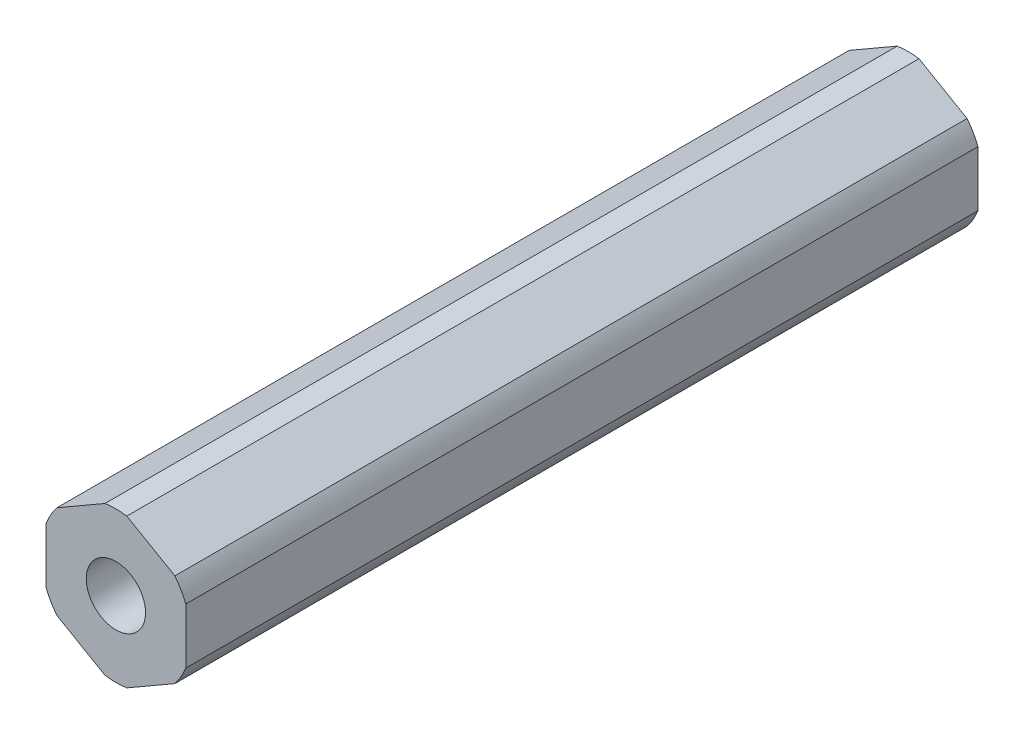
ISO-10303-21;
HEADER;
FILE_DESCRIPTION(('STEP AP214'),'2;1');
FILE_NAME('part.step','',(''),(''),'','','');
FILE_SCHEMA(('AUTOMOTIVE_DESIGN { 1 0 10303 214 1 1 1 1 }'));
ENDSEC;
DATA;
#1=APPLICATION_CONTEXT('core data for automotive mechanical design processes');
#2=APPLICATION_PROTOCOL_DEFINITION('international standard','automotive_design',2000,#1);
#3=PRODUCT_CONTEXT('',#1,'mechanical');
#4=PRODUCT('Part','Part','',(#3));
#5=PRODUCT_RELATED_PRODUCT_CATEGORY('part','',(#4));
#6=PRODUCT_DEFINITION_FORMATION('','',#4);
#7=PRODUCT_DEFINITION_CONTEXT('part definition',#1,'design');
#8=PRODUCT_DEFINITION('design','',#6,#7);
#9=PRODUCT_DEFINITION_SHAPE('','',#8);
#10=(LENGTH_UNIT() NAMED_UNIT(*) SI_UNIT(.MILLI.,.METRE.));
#11=(NAMED_UNIT(*) PLANE_ANGLE_UNIT() SI_UNIT($,.RADIAN.));
#12=(NAMED_UNIT(*) SI_UNIT($,.STERADIAN.) SOLID_ANGLE_UNIT());
#13=UNCERTAINTY_MEASURE_WITH_UNIT(LENGTH_MEASURE(1.E-05),#10,'distance_accuracy_value','');
#14=(GEOMETRIC_REPRESENTATION_CONTEXT(3) GLOBAL_UNCERTAINTY_ASSIGNED_CONTEXT((#13)) GLOBAL_UNIT_ASSIGNED_CONTEXT((#10,
#11,#12)) REPRESENTATION_CONTEXT('',''));
#15=CARTESIAN_POINT('',(0.,0.,0.));
#16=DIRECTION('',(0.,0.,1.));
#17=DIRECTION('',(1.,0.,0.));
#18=AXIS2_PLACEMENT_3D('',#15,#16,#17);
#19=CARTESIAN_POINT('',(4.7625,0.,26.9875));
#20=DIRECTION('',(-1.,0.,0.));
#21=DIRECTION('',(0.,-1.,0.));
#22=AXIS2_PLACEMENT_3D('',#19,#20,#21);
#23=PLANE('',#22);
#24=DIRECTION('',(0.,1.,0.));
#25=VECTOR('',#24,1.);
#26=CARTESIAN_POINT('',(4.7625,0.,-26.9875));
#27=LINE('',#26,#25);
#28=CARTESIAN_POINT('',(4.7625,-1.89171391930704,-26.9875));
#29=VERTEX_POINT('',#28);
#30=CARTESIAN_POINT('',(4.7625,1.89171391930704,-26.9875));
#31=VERTEX_POINT('',#30);
#32=EDGE_CURVE('E156',#29,#31,#27,.T.);
#33=ORIENTED_EDGE('',*,*,#32,.T.);
#34=DIRECTION('',(0.,0.,-1.));
#35=VECTOR('',#34,1.);
#36=CARTESIAN_POINT('',(4.7625,1.89171391930704,26.9875));
#37=LINE('',#36,#35);
#38=CARTESIAN_POINT('',(4.7625,1.89171391930704,26.9875));
#39=VERTEX_POINT('',#38);
#40=EDGE_CURVE('E11',#39,#31,#37,.T.);
#41=ORIENTED_EDGE('',*,*,#40,.F.);
#42=DIRECTION('',(0.,1.,0.));
#43=VECTOR('',#42,1.);
#44=CARTESIAN_POINT('',(4.7625,0.,26.9875));
#45=LINE('',#44,#43);
#46=CARTESIAN_POINT('',(4.7625,-1.89171391930704,26.9875));
#47=VERTEX_POINT('',#46);
#48=EDGE_CURVE('E214',#47,#39,#45,.T.);
#49=ORIENTED_EDGE('',*,*,#48,.F.);
#50=DIRECTION('',(0.,0.,-1.));
#51=VECTOR('',#50,1.);
#52=CARTESIAN_POINT('',(4.7625,-1.89171391930704,26.9875));
#53=LINE('',#52,#51);
#54=EDGE_CURVE('E152',#47,#29,#53,.T.);
#55=ORIENTED_EDGE('',*,*,#54,.T.);
#56=EDGE_LOOP('',(#33,#41,#49,#55));
#57=FACE_BOUND('',#56,.T.);
#58=ADVANCED_FACE('F35',(#57),#23,.F.);
#59=CARTESIAN_POINT('',(0.,0.,26.9875));
#60=DIRECTION('',(0.,0.,-1.));
#61=DIRECTION('',(-1.,0.,0.));
#62=AXIS2_PLACEMENT_3D('',#59,#60,#61);
#63=CYLINDRICAL_SURFACE('',#62,5.12445);
#64=CARTESIAN_POINT('',(0.,0.,-26.9875));
#65=DIRECTION('',(0.,0.,1.));
#66=DIRECTION('',(1.,0.,0.));
#67=AXIS2_PLACEMENT_3D('',#64,#65,#66);
#68=CIRCLE('',#67,5.12445);
#69=CARTESIAN_POINT('',(4.01952231081252,3.17858902586987,-26.9875));
#70=VERTEX_POINT('',#69);
#71=EDGE_CURVE('E159',#31,#70,#68,.T.);
#72=ORIENTED_EDGE('',*,*,#71,.T.);
#73=DIRECTION('',(0.,0.,-1.));
#74=VECTOR('',#73,1.);
#75=CARTESIAN_POINT('',(4.01952231081252,3.17858902586987,26.9875));
#76=LINE('',#75,#74);
#77=CARTESIAN_POINT('',(4.01952231081252,3.17858902586987,26.9875));
#78=VERTEX_POINT('',#77);
#79=EDGE_CURVE('E43',#78,#70,#76,.T.);
#80=ORIENTED_EDGE('',*,*,#79,.F.);
#81=CARTESIAN_POINT('',(0.,0.,26.9875));
#82=DIRECTION('',(0.,0.,1.));
#83=DIRECTION('',(1.,0.,0.));
#84=AXIS2_PLACEMENT_3D('',#81,#82,#83);
#85=CIRCLE('',#84,5.12445);
#86=EDGE_CURVE('E106',#39,#78,#85,.T.);
#87=ORIENTED_EDGE('',*,*,#86,.F.);
#88=ORIENTED_EDGE('',*,*,#40,.T.);
#89=EDGE_LOOP('',(#72,#80,#87,#88));
#90=FACE_BOUND('',#89,.T.);
#91=ADVANCED_FACE('F249',(#90),#63,.T.);
#92=CARTESIAN_POINT('',(2.38125,4.12444598552339,26.9875));
#93=DIRECTION('',(-0.5,-0.866025403784439,0.));
#94=DIRECTION('',(0.866025403784439,-0.5,0.));
#95=AXIS2_PLACEMENT_3D('',#92,#93,#94);
#96=PLANE('',#95);
#97=DIRECTION('',(-0.866025403784439,0.5,0.));
#98=VECTOR('',#97,1.);
#99=CARTESIAN_POINT('',(2.38125,4.12444598552339,-26.9875));
#100=LINE('',#99,#98);
#101=CARTESIAN_POINT('',(0.742977689187476,5.07030294517691,-26.9875));
#102=VERTEX_POINT('',#101);
#103=EDGE_CURVE('E162',#70,#102,#100,.T.);
#104=ORIENTED_EDGE('',*,*,#103,.T.);
#105=DIRECTION('',(0.,0.,-1.));
#106=VECTOR('',#105,1.);
#107=CARTESIAN_POINT('',(0.742977689187476,5.07030294517691,26.9875));
#108=LINE('',#107,#106);
#109=CARTESIAN_POINT('',(0.742977689187476,5.07030294517691,26.9875));
#110=VERTEX_POINT('',#109);
#111=EDGE_CURVE('E192',#110,#102,#108,.T.);
#112=ORIENTED_EDGE('',*,*,#111,.F.);
#113=DIRECTION('',(-0.866025403784439,0.5,0.));
#114=VECTOR('',#113,1.);
#115=CARTESIAN_POINT('',(2.38125,4.12444598552339,26.9875));
#116=LINE('',#115,#114);
#117=EDGE_CURVE('E200',#78,#110,#116,.T.);
#118=ORIENTED_EDGE('',*,*,#117,.F.);
#119=ORIENTED_EDGE('',*,*,#79,.T.);
#120=EDGE_LOOP('',(#104,#112,#118,#119));
#121=FACE_BOUND('',#120,.T.);
#122=ADVANCED_FACE('F198',(#121),#96,.F.);
#123=CARTESIAN_POINT('',(-0.742977689187479,5.07030294517691,-26.9875));
#124=VERTEX_POINT('',#123);
#125=EDGE_CURVE('E163',#102,#124,#68,.T.);
#126=ORIENTED_EDGE('',*,*,#125,.T.);
#127=DIRECTION('',(0.,0.,-1.));
#128=VECTOR('',#127,1.);
#129=CARTESIAN_POINT('',(-0.742977689187479,5.07030294517691,26.9875));
#130=LINE('',#129,#128);
#131=CARTESIAN_POINT('',(-0.742977689187479,5.07030294517691,26.9875));
#132=VERTEX_POINT('',#131);
#133=EDGE_CURVE('E189',#132,#124,#130,.T.);
#134=ORIENTED_EDGE('',*,*,#133,.F.);
#135=EDGE_CURVE('E218',#110,#132,#85,.T.);
#136=ORIENTED_EDGE('',*,*,#135,.F.);
#137=ORIENTED_EDGE('',*,*,#111,.T.);
#138=EDGE_LOOP('',(#126,#134,#136,#137));
#139=FACE_BOUND('',#138,.T.);
#140=ADVANCED_FACE('F233',(#139),#63,.T.);
#141=CARTESIAN_POINT('',(-2.38125,4.12444598552339,26.9875));
#142=DIRECTION('',(0.5,-0.866025403784438,0.));
#143=DIRECTION('',(0.866025403784438,0.5,0.));
#144=AXIS2_PLACEMENT_3D('',#141,#142,#143);
#145=PLANE('',#144);
#146=DIRECTION('',(-0.866025403784438,-0.5,0.));
#147=VECTOR('',#146,1.);
#148=CARTESIAN_POINT('',(-2.38125,4.12444598552339,-26.9875));
#149=LINE('',#148,#147);
#150=CARTESIAN_POINT('',(-4.01952231081252,3.17858902586987,-26.9875));
#151=VERTEX_POINT('',#150);
#152=EDGE_CURVE('E165',#124,#151,#149,.T.);
#153=ORIENTED_EDGE('',*,*,#152,.T.);
#154=DIRECTION('',(0.,0.,-1.));
#155=VECTOR('',#154,1.);
#156=CARTESIAN_POINT('',(-4.01952231081252,3.17858902586987,26.9875));
#157=LINE('',#156,#155);
#158=CARTESIAN_POINT('',(-4.01952231081252,3.17858902586987,26.9875));
#159=VERTEX_POINT('',#158);
#160=EDGE_CURVE('E186',#159,#151,#157,.T.);
#161=ORIENTED_EDGE('',*,*,#160,.F.);
#162=DIRECTION('',(-0.866025403784438,-0.5,0.));
#163=VECTOR('',#162,1.);
#164=CARTESIAN_POINT('',(-2.38125,4.12444598552339,26.9875));
#165=LINE('',#164,#163);
#166=EDGE_CURVE('E224',#132,#159,#165,.T.);
#167=ORIENTED_EDGE('',*,*,#166,.F.);
#168=ORIENTED_EDGE('',*,*,#133,.T.);
#169=EDGE_LOOP('',(#153,#161,#167,#168));
#170=FACE_BOUND('',#169,.T.);
#171=ADVANCED_FACE('F235',(#170),#145,.F.);
#172=CARTESIAN_POINT('',(-4.7625,1.89171391930703,-26.9875));
#173=VERTEX_POINT('',#172);
#174=EDGE_CURVE('E167',#151,#173,#68,.T.);
#175=ORIENTED_EDGE('',*,*,#174,.T.);
#176=DIRECTION('',(0.,0.,-1.));
#177=VECTOR('',#176,1.);
#178=CARTESIAN_POINT('',(-4.7625,1.89171391930703,26.9875));
#179=LINE('',#178,#177);
#180=CARTESIAN_POINT('',(-4.7625,1.89171391930703,26.9875));
#181=VERTEX_POINT('',#180);
#182=EDGE_CURVE('E183',#181,#173,#179,.T.);
#183=ORIENTED_EDGE('',*,*,#182,.F.);
#184=EDGE_CURVE('E225',#159,#181,#85,.T.);
#185=ORIENTED_EDGE('',*,*,#184,.F.);
#186=ORIENTED_EDGE('',*,*,#160,.T.);
#187=EDGE_LOOP('',(#175,#183,#185,#186));
#188=FACE_BOUND('',#187,.T.);
#189=ADVANCED_FACE('F236',(#188),#63,.T.);
#190=CARTESIAN_POINT('',(-4.7625,0.,26.9875));
#191=DIRECTION('',(1.,0.,0.));
#192=DIRECTION('',(0.,1.,0.));
#193=AXIS2_PLACEMENT_3D('',#190,#191,#192);
#194=PLANE('',#193);
#195=DIRECTION('',(0.,-1.,0.));
#196=VECTOR('',#195,1.);
#197=CARTESIAN_POINT('',(-4.7625,0.,-26.9875));
#198=LINE('',#197,#196);
#199=CARTESIAN_POINT('',(-4.7625,-1.89171391930704,-26.9875));
#200=VERTEX_POINT('',#199);
#201=EDGE_CURVE('E168',#173,#200,#198,.T.);
#202=ORIENTED_EDGE('',*,*,#201,.T.);
#203=DIRECTION('',(0.,0.,-1.));
#204=VECTOR('',#203,1.);
#205=CARTESIAN_POINT('',(-4.7625,-1.89171391930704,26.9875));
#206=LINE('',#205,#204);
#207=CARTESIAN_POINT('',(-4.7625,-1.89171391930704,26.9875));
#208=VERTEX_POINT('',#207);
#209=EDGE_CURVE('E180',#208,#200,#206,.T.);
#210=ORIENTED_EDGE('',*,*,#209,.F.);
#211=DIRECTION('',(0.,-1.,0.));
#212=VECTOR('',#211,1.);
#213=CARTESIAN_POINT('',(-4.7625,0.,26.9875));
#214=LINE('',#213,#212);
#215=EDGE_CURVE('E226',#181,#208,#214,.T.);
#216=ORIENTED_EDGE('',*,*,#215,.F.);
#217=ORIENTED_EDGE('',*,*,#182,.T.);
#218=EDGE_LOOP('',(#202,#210,#216,#217));
#219=FACE_BOUND('',#218,.T.);
#220=ADVANCED_FACE('F239',(#219),#194,.F.);
#221=CARTESIAN_POINT('',(-4.01952231081252,-3.17858902586988,-26.9875));
#222=VERTEX_POINT('',#221);
#223=EDGE_CURVE('E170',#200,#222,#68,.T.);
#224=ORIENTED_EDGE('',*,*,#223,.T.);
#225=DIRECTION('',(0.,0.,-1.));
#226=VECTOR('',#225,1.);
#227=CARTESIAN_POINT('',(-4.01952231081252,-3.17858902586988,26.9875));
#228=LINE('',#227,#226);
#229=CARTESIAN_POINT('',(-4.01952231081252,-3.17858902586988,26.9875));
#230=VERTEX_POINT('',#229);
#231=EDGE_CURVE('E177',#230,#222,#228,.T.);
#232=ORIENTED_EDGE('',*,*,#231,.F.);
#233=EDGE_CURVE('E142',#208,#230,#85,.T.);
#234=ORIENTED_EDGE('',*,*,#233,.F.);
#235=ORIENTED_EDGE('',*,*,#209,.T.);
#236=EDGE_LOOP('',(#224,#232,#234,#235));
#237=FACE_BOUND('',#236,.T.);
#238=ADVANCED_FACE('F241',(#237),#63,.T.);
#239=CARTESIAN_POINT('',(-2.38125,-4.12444598552339,26.9875));
#240=DIRECTION('',(0.5,0.866025403784439,0.));
#241=DIRECTION('',(-0.866025403784439,0.5,0.));
#242=AXIS2_PLACEMENT_3D('',#239,#240,#241);
#243=PLANE('',#242);
#244=DIRECTION('',(0.866025403784439,-0.5,0.));
#245=VECTOR('',#244,1.);
#246=CARTESIAN_POINT('',(-2.38125,-4.12444598552339,-26.9875));
#247=LINE('',#246,#245);
#248=CARTESIAN_POINT('',(-0.742977689187483,-5.07030294517691,-26.9875));
#249=VERTEX_POINT('',#248);
#250=EDGE_CURVE('E171',#222,#249,#247,.T.);
#251=ORIENTED_EDGE('',*,*,#250,.T.);
#252=DIRECTION('',(0.,0.,-1.));
#253=VECTOR('',#252,1.);
#254=CARTESIAN_POINT('',(-0.742977689187483,-5.07030294517691,26.9875));
#255=LINE('',#254,#253);
#256=CARTESIAN_POINT('',(-0.742977689187483,-5.07030294517691,26.9875));
#257=VERTEX_POINT('',#256);
#258=EDGE_CURVE('E147',#257,#249,#255,.T.);
#259=ORIENTED_EDGE('',*,*,#258,.F.);
#260=DIRECTION('',(0.866025403784439,-0.5,0.));
#261=VECTOR('',#260,1.);
#262=CARTESIAN_POINT('',(-2.38125,-4.12444598552339,26.9875));
#263=LINE('',#262,#261);
#264=EDGE_CURVE('E137',#230,#257,#263,.T.);
#265=ORIENTED_EDGE('',*,*,#264,.F.);
#266=ORIENTED_EDGE('',*,*,#231,.T.);
#267=EDGE_LOOP('',(#251,#259,#265,#266));
#268=FACE_BOUND('',#267,.T.);
#269=ADVANCED_FACE('F244',(#268),#243,.F.);
#270=CARTESIAN_POINT('',(0.742977689187482,-5.07030294517691,-26.9875));
#271=VERTEX_POINT('',#270);
#272=EDGE_CURVE('E146',#249,#271,#68,.T.);
#273=ORIENTED_EDGE('',*,*,#272,.T.);
#274=DIRECTION('',(0.,0.,-1.));
#275=VECTOR('',#274,1.);
#276=CARTESIAN_POINT('',(0.742977689187482,-5.07030294517691,26.9875));
#277=LINE('',#276,#275);
#278=CARTESIAN_POINT('',(0.742977689187482,-5.07030294517691,26.9875));
#279=VERTEX_POINT('',#278);
#280=EDGE_CURVE('E143',#279,#271,#277,.T.);
#281=ORIENTED_EDGE('',*,*,#280,.F.);
#282=EDGE_CURVE('E131',#257,#279,#85,.T.);
#283=ORIENTED_EDGE('',*,*,#282,.F.);
#284=ORIENTED_EDGE('',*,*,#258,.T.);
#285=EDGE_LOOP('',(#273,#281,#283,#284));
#286=FACE_BOUND('',#285,.T.);
#287=ADVANCED_FACE('F144',(#286),#63,.T.);
#288=CARTESIAN_POINT('',(2.38125,-4.12444598552339,26.9875));
#289=DIRECTION('',(-0.500000000000001,0.866025403784438,0.));
#290=DIRECTION('',(-0.866025403784438,-0.500000000000001,0.));
#291=AXIS2_PLACEMENT_3D('',#288,#289,#290);
#292=PLANE('',#291);
#293=DIRECTION('',(0.866025403784438,0.500000000000001,0.));
#294=VECTOR('',#293,1.);
#295=CARTESIAN_POINT('',(2.38125,-4.12444598552339,-26.9875));
#296=LINE('',#295,#294);
#297=CARTESIAN_POINT('',(4.01952231081252,-3.17858902586987,-26.9875));
#298=VERTEX_POINT('',#297);
#299=EDGE_CURVE('E92',#271,#298,#296,.T.);
#300=ORIENTED_EDGE('',*,*,#299,.T.);
#301=DIRECTION('',(0.,0.,-1.));
#302=VECTOR('',#301,1.);
#303=CARTESIAN_POINT('',(4.01952231081252,-3.17858902586987,26.9875));
#304=LINE('',#303,#302);
#305=CARTESIAN_POINT('',(4.01952231081252,-3.17858902586987,26.9875));
#306=VERTEX_POINT('',#305);
#307=EDGE_CURVE('E148',#306,#298,#304,.T.);
#308=ORIENTED_EDGE('',*,*,#307,.F.);
#309=DIRECTION('',(0.866025403784438,0.500000000000001,0.));
#310=VECTOR('',#309,1.);
#311=CARTESIAN_POINT('',(2.38125,-4.12444598552339,26.9875));
#312=LINE('',#311,#310);
#313=EDGE_CURVE('E135',#279,#306,#312,.T.);
#314=ORIENTED_EDGE('',*,*,#313,.F.);
#315=ORIENTED_EDGE('',*,*,#280,.T.);
#316=EDGE_LOOP('',(#300,#308,#314,#315));
#317=FACE_BOUND('',#316,.T.);
#318=ADVANCED_FACE('F150',(#317),#292,.F.);
#319=EDGE_CURVE('E98',#298,#29,#68,.T.);
#320=ORIENTED_EDGE('',*,*,#319,.T.);
#321=ORIENTED_EDGE('',*,*,#54,.F.);
#322=EDGE_CURVE('E51',#306,#47,#85,.T.);
#323=ORIENTED_EDGE('',*,*,#322,.F.);
#324=ORIENTED_EDGE('',*,*,#307,.T.);
#325=EDGE_LOOP('',(#320,#321,#323,#324));
#326=FACE_BOUND('',#325,.T.);
#327=ADVANCED_FACE('F246',(#326),#63,.T.);
#328=CARTESIAN_POINT('',(0.,0.,26.9875));
#329=DIRECTION('',(0.,0.,1.));
#330=DIRECTION('',(1.,0.,0.));
#331=AXIS2_PLACEMENT_3D('',#328,#329,#330);
#332=PLANE('',#331);
#333=CARTESIAN_POINT('',(0.,0.,26.9875));
#334=DIRECTION('',(0.,0.,-1.));
#335=DIRECTION('',(-1.,0.,0.));
#336=AXIS2_PLACEMENT_3D('',#333,#334,#335);
#337=CIRCLE('',#336,2.0193);
#338=CARTESIAN_POINT('',(2.0193,0.,26.9875));
#339=VERTEX_POINT('',#338);
#340=EDGE_CURVE('E378',#339,#339,#337,.T.);
#341=ORIENTED_EDGE('',*,*,#340,.T.);
#342=EDGE_LOOP('',(#341));
#343=FACE_BOUND('',#342,.T.);
#344=ORIENTED_EDGE('',*,*,#48,.T.);
#345=ORIENTED_EDGE('',*,*,#86,.T.);
#346=ORIENTED_EDGE('',*,*,#117,.T.);
#347=ORIENTED_EDGE('',*,*,#135,.T.);
#348=ORIENTED_EDGE('',*,*,#166,.T.);
#349=ORIENTED_EDGE('',*,*,#184,.T.);
#350=ORIENTED_EDGE('',*,*,#215,.T.);
#351=ORIENTED_EDGE('',*,*,#233,.T.);
#352=ORIENTED_EDGE('',*,*,#264,.T.);
#353=ORIENTED_EDGE('',*,*,#282,.T.);
#354=ORIENTED_EDGE('',*,*,#313,.T.);
#355=ORIENTED_EDGE('',*,*,#322,.T.);
#356=EDGE_LOOP('',(#344,#345,#346,#347,#348,#349,#350,#351,#352,#353,#354,#355));
#357=FACE_BOUND('',#356,.T.);
#358=ADVANCED_FACE('F133',(#343,#357),#332,.T.);
#359=CARTESIAN_POINT('',(0.,0.,-26.9875));
#360=DIRECTION('',(0.,0.,1.));
#361=DIRECTION('',(1.,0.,0.));
#362=AXIS2_PLACEMENT_3D('',#359,#360,#361);
#363=PLANE('',#362);
#364=CARTESIAN_POINT('',(0.,0.,-26.9875));
#365=DIRECTION('',(0.,0.,-1.));
#366=DIRECTION('',(-1.,0.,0.));
#367=AXIS2_PLACEMENT_3D('',#364,#365,#366);
#368=CIRCLE('',#367,2.0193);
#369=CARTESIAN_POINT('',(-2.0193,0.,-26.9875));
#370=VERTEX_POINT('',#369);
#371=EDGE_CURVE('E220',#370,#370,#368,.T.);
#372=ORIENTED_EDGE('',*,*,#371,.F.);
#373=EDGE_LOOP('',(#372));
#374=FACE_BOUND('',#373,.T.);
#375=ORIENTED_EDGE('',*,*,#32,.F.);
#376=ORIENTED_EDGE('',*,*,#319,.F.);
#377=ORIENTED_EDGE('',*,*,#299,.F.);
#378=ORIENTED_EDGE('',*,*,#272,.F.);
#379=ORIENTED_EDGE('',*,*,#250,.F.);
#380=ORIENTED_EDGE('',*,*,#223,.F.);
#381=ORIENTED_EDGE('',*,*,#201,.F.);
#382=ORIENTED_EDGE('',*,*,#174,.F.);
#383=ORIENTED_EDGE('',*,*,#152,.F.);
#384=ORIENTED_EDGE('',*,*,#125,.F.);
#385=ORIENTED_EDGE('',*,*,#103,.F.);
#386=ORIENTED_EDGE('',*,*,#71,.F.);
#387=EDGE_LOOP('',(#375,#376,#377,#378,#379,#380,#381,#382,#383,#384,#385,#386));
#388=FACE_BOUND('',#387,.T.);
#389=ADVANCED_FACE('F204',(#374,#388),#363,.F.);
#390=CARTESIAN_POINT('',(0.,0.,-7.9375));
#391=DIRECTION('',(0.,0.,-1.));
#392=DIRECTION('',(-1.,0.,0.));
#393=AXIS2_PLACEMENT_3D('',#390,#391,#392);
#394=CYLINDRICAL_SURFACE('',#393,2.0193);
#395=CARTESIAN_POINT('',(0.,0.,-7.9375));
#396=DIRECTION('',(0.,0.,-1.));
#397=DIRECTION('',(-1.,0.,0.));
#398=AXIS2_PLACEMENT_3D('',#395,#396,#397);
#399=CIRCLE('',#398,2.0193);
#400=CARTESIAN_POINT('',(-2.0193,0.,-7.9375));
#401=VERTEX_POINT('',#400);
#402=EDGE_CURVE('E160',#401,#401,#399,.T.);
#403=CARTESIAN_POINT('',(-2.0193,0.,-7.9375));
#404=CARTESIAN_POINT('',(-2.0193,0.,-8.1359375));
#405=CARTESIAN_POINT('',(-2.0193,0.,-8.334375));
#406=CARTESIAN_POINT('',(-2.0193,0.,-8.73125));
#407=CARTESIAN_POINT('',(-2.0193,0.,-8.92968749999999));
#408=CARTESIAN_POINT('',(-2.0193,0.,-9.3265625));
#409=CARTESIAN_POINT('',(-2.0193,0.,-9.525));
#410=CARTESIAN_POINT('',(-2.0193,0.,-9.921875));
#411=CARTESIAN_POINT('',(-2.0193,0.,-10.1203125));
#412=CARTESIAN_POINT('',(-2.0193,0.,-10.5171875));
#413=CARTESIAN_POINT('',(-2.0193,0.,-10.715625));
#414=CARTESIAN_POINT('',(-2.0193,0.,-11.1125));
#415=CARTESIAN_POINT('',(-2.0193,0.,-11.3109375));
#416=CARTESIAN_POINT('',(-2.0193,0.,-11.7078125));
#417=CARTESIAN_POINT('',(-2.0193,0.,-11.90625));
#418=CARTESIAN_POINT('',(-2.0193,0.,-12.303125));
#419=CARTESIAN_POINT('',(-2.0193,0.,-12.5015625));
#420=CARTESIAN_POINT('',(-2.0193,0.,-12.8984375));
#421=CARTESIAN_POINT('',(-2.0193,0.,-13.096875));
#422=CARTESIAN_POINT('',(-2.0193,0.,-13.49375));
#423=CARTESIAN_POINT('',(-2.0193,0.,-13.6921875));
#424=CARTESIAN_POINT('',(-2.0193,0.,-14.0890625));
#425=CARTESIAN_POINT('',(-2.0193,0.,-14.2875));
#426=CARTESIAN_POINT('',(-2.0193,0.,-14.684375));
#427=CARTESIAN_POINT('',(-2.0193,0.,-14.8828125));
#428=CARTESIAN_POINT('',(-2.0193,0.,-15.2796875));
#429=CARTESIAN_POINT('',(-2.0193,0.,-15.478125));
#430=CARTESIAN_POINT('',(-2.0193,0.,-15.875));
#431=CARTESIAN_POINT('',(-2.0193,0.,-16.0734375));
#432=CARTESIAN_POINT('',(-2.0193,0.,-16.4703125));
#433=CARTESIAN_POINT('',(-2.0193,0.,-16.66875));
#434=CARTESIAN_POINT('',(-2.0193,0.,-17.065625));
#435=CARTESIAN_POINT('',(-2.0193,0.,-17.2640625));
#436=CARTESIAN_POINT('',(-2.0193,0.,-17.6609375));
#437=CARTESIAN_POINT('',(-2.0193,0.,-17.859375));
#438=CARTESIAN_POINT('',(-2.0193,0.,-18.25625));
#439=CARTESIAN_POINT('',(-2.0193,0.,-18.4546875));
#440=CARTESIAN_POINT('',(-2.0193,0.,-18.8515625));
#441=CARTESIAN_POINT('',(-2.0193,0.,-19.05));
#442=CARTESIAN_POINT('',(-2.0193,0.,-19.446875));
#443=CARTESIAN_POINT('',(-2.0193,0.,-19.6453125));
#444=CARTESIAN_POINT('',(-2.0193,0.,-20.0421875));
#445=CARTESIAN_POINT('',(-2.0193,0.,-20.240625));
#446=CARTESIAN_POINT('',(-2.0193,0.,-20.6375));
#447=CARTESIAN_POINT('',(-2.0193,0.,-20.8359375));
#448=CARTESIAN_POINT('',(-2.0193,0.,-21.2328125));
#449=CARTESIAN_POINT('',(-2.0193,0.,-21.43125));
#450=CARTESIAN_POINT('',(-2.0193,0.,-21.828125));
#451=CARTESIAN_POINT('',(-2.0193,0.,-22.0265625));
#452=CARTESIAN_POINT('',(-2.0193,0.,-22.4234375));
#453=CARTESIAN_POINT('',(-2.0193,0.,-22.621875));
#454=CARTESIAN_POINT('',(-2.0193,0.,-23.01875));
#455=CARTESIAN_POINT('',(-2.0193,0.,-23.2171875));
#456=CARTESIAN_POINT('',(-2.0193,0.,-23.6140625));
#457=CARTESIAN_POINT('',(-2.0193,0.,-23.8125));
#458=CARTESIAN_POINT('',(-2.0193,0.,-24.209375));
#459=CARTESIAN_POINT('',(-2.0193,0.,-24.4078125));
#460=CARTESIAN_POINT('',(-2.0193,0.,-24.8046875));
#461=CARTESIAN_POINT('',(-2.0193,0.,-25.003125));
#462=CARTESIAN_POINT('',(-2.0193,0.,-25.4));
#463=CARTESIAN_POINT('',(-2.0193,0.,-25.5984375));
#464=CARTESIAN_POINT('',(-2.0193,0.,-25.9953125));
#465=CARTESIAN_POINT('',(-2.0193,0.,-26.19375));
#466=CARTESIAN_POINT('',(-2.0193,0.,-26.590625));
#467=CARTESIAN_POINT('',(-2.0193,0.,-26.7890625));
#468=CARTESIAN_POINT('',(-2.0193,0.,-26.9875));
#469=B_SPLINE_CURVE_WITH_KNOTS('',3,(#403,#404,#405,#406,#407,#408,#409,#410,#411,#412,#413,
#414,#415,#416,#417,#418,#419,#420,#421,#422,#423,#424,#425,#426,#427,#428,#429,#430,#431,#432,
#433,#434,#435,#436,#437,#438,#439,#440,#441,#442,#443,#444,#445,#446,#447,#448,#449,#450,#451,
#452,#453,#454,#455,#456,#457,#458,#459,#460,#461,#462,#463,#464,#465,#466,#467,#468),
.UNSPECIFIED.,.F.,.F.,(4,2,2,2,2,2,2,2,2,2,2,2,2,2,2,2,2,2,2,2,2,2,2,2,2,2,2,2,2,2,2,2,4),(0.,
0.595312499999999,1.190625,1.7859375,2.38125,2.9765625,3.571875,4.1671875,4.7625,5.3578125,
5.953125,6.5484375,7.14375,7.7390625,8.334375,8.9296875,9.525,10.1203125,10.715625,11.3109375,
11.90625,12.5015625,13.096875,13.6921875,14.2875,14.8828125,15.478125,16.0734375,16.66875,
17.2640625,17.859375,18.4546875,19.05),.UNSPECIFIED.);
#470=EDGE_CURVE('BSEAM327',#401,#370,#469,.T.);
#471=ORIENTED_EDGE('',*,*,#402,.F.);
#472=ORIENTED_EDGE('',*,*,#371,.T.);
#473=ORIENTED_EDGE('',*,*,#470,.T.);
#474=ORIENTED_EDGE('',*,*,#470,.F.);
#475=EDGE_LOOP('',(#471,#473,#472,#474));
#476=FACE_BOUND('',#475,.T.);
#477=ADVANCED_FACE('F327',(#476),#394,.F.);
#478=CARTESIAN_POINT('',(0.,0.,-7.9375));
#479=DIRECTION('',(0.,0.,-1.));
#480=DIRECTION('',(-1.,0.,0.));
#481=AXIS2_PLACEMENT_3D('',#478,#479,#480);
#482=PLANE('',#481);
#483=ORIENTED_EDGE('',*,*,#402,.T.);
#484=EDGE_LOOP('',(#483));
#485=FACE_BOUND('',#484,.T.);
#486=ADVANCED_FACE('F336',(#485),#482,.T.);
#487=CARTESIAN_POINT('',(0.,0.,7.9375));
#488=DIRECTION('',(0.,0.,1.));
#489=DIRECTION('',(1.,0.,0.));
#490=AXIS2_PLACEMENT_3D('',#487,#488,#489);
#491=CYLINDRICAL_SURFACE('',#490,2.0193);
#492=CARTESIAN_POINT('',(0.,0.,7.9375));
#493=DIRECTION('',(0.,0.,-1.));
#494=DIRECTION('',(-1.,0.,0.));
#495=AXIS2_PLACEMENT_3D('',#492,#493,#494);
#496=CIRCLE('',#495,2.0193);
#497=CARTESIAN_POINT('',(2.0193,0.,7.9375));
#498=VERTEX_POINT('',#497);
#499=EDGE_CURVE('E377',#498,#498,#496,.T.);
#500=CARTESIAN_POINT('',(2.0193,0.,7.9375));
#501=CARTESIAN_POINT('',(2.0193,0.,8.1359375));
#502=CARTESIAN_POINT('',(2.0193,0.,8.334375));
#503=CARTESIAN_POINT('',(2.0193,0.,8.73125));
#504=CARTESIAN_POINT('',(2.0193,0.,8.9296875));
#505=CARTESIAN_POINT('',(2.0193,0.,9.3265625));
#506=CARTESIAN_POINT('',(2.0193,0.,9.525));
#507=CARTESIAN_POINT('',(2.0193,0.,9.921875));
#508=CARTESIAN_POINT('',(2.0193,0.,10.1203125));
#509=CARTESIAN_POINT('',(2.0193,0.,10.5171875));
#510=CARTESIAN_POINT('',(2.0193,0.,10.715625));
#511=CARTESIAN_POINT('',(2.0193,0.,11.1125));
#512=CARTESIAN_POINT('',(2.0193,0.,11.3109375));
#513=CARTESIAN_POINT('',(2.0193,0.,11.7078125));
#514=CARTESIAN_POINT('',(2.0193,0.,11.90625));
#515=CARTESIAN_POINT('',(2.0193,0.,12.303125));
#516=CARTESIAN_POINT('',(2.0193,0.,12.5015625));
#517=CARTESIAN_POINT('',(2.0193,0.,12.8984375));
#518=CARTESIAN_POINT('',(2.0193,0.,13.096875));
#519=CARTESIAN_POINT('',(2.0193,0.,13.49375));
#520=CARTESIAN_POINT('',(2.0193,0.,13.6921875));
#521=CARTESIAN_POINT('',(2.0193,0.,14.0890625));
#522=CARTESIAN_POINT('',(2.0193,0.,14.2875));
#523=CARTESIAN_POINT('',(2.0193,0.,14.684375));
#524=CARTESIAN_POINT('',(2.0193,0.,14.8828125));
#525=CARTESIAN_POINT('',(2.0193,0.,15.2796875));
#526=CARTESIAN_POINT('',(2.0193,0.,15.478125));
#527=CARTESIAN_POINT('',(2.0193,0.,15.875));
#528=CARTESIAN_POINT('',(2.0193,0.,16.0734375));
#529=CARTESIAN_POINT('',(2.0193,0.,16.4703125));
#530=CARTESIAN_POINT('',(2.0193,0.,16.66875));
#531=CARTESIAN_POINT('',(2.0193,0.,17.065625));
#532=CARTESIAN_POINT('',(2.0193,0.,17.2640625));
#533=CARTESIAN_POINT('',(2.0193,0.,17.6609375));
#534=CARTESIAN_POINT('',(2.0193,0.,17.859375));
#535=CARTESIAN_POINT('',(2.0193,0.,18.25625));
#536=CARTESIAN_POINT('',(2.0193,0.,18.4546875));
#537=CARTESIAN_POINT('',(2.0193,0.,18.8515625));
#538=CARTESIAN_POINT('',(2.0193,0.,19.05));
#539=CARTESIAN_POINT('',(2.0193,0.,19.446875));
#540=CARTESIAN_POINT('',(2.0193,0.,19.6453125));
#541=CARTESIAN_POINT('',(2.0193,0.,20.0421875));
#542=CARTESIAN_POINT('',(2.0193,0.,20.240625));
#543=CARTESIAN_POINT('',(2.0193,0.,20.6375));
#544=CARTESIAN_POINT('',(2.0193,0.,20.8359375));
#545=CARTESIAN_POINT('',(2.0193,0.,21.2328125));
#546=CARTESIAN_POINT('',(2.0193,0.,21.43125));
#547=CARTESIAN_POINT('',(2.0193,0.,21.828125));
#548=CARTESIAN_POINT('',(2.0193,0.,22.0265625));
#549=CARTESIAN_POINT('',(2.0193,0.,22.4234375));
#550=CARTESIAN_POINT('',(2.0193,0.,22.621875));
#551=CARTESIAN_POINT('',(2.0193,0.,23.01875));
#552=CARTESIAN_POINT('',(2.0193,0.,23.2171875));
#553=CARTESIAN_POINT('',(2.0193,0.,23.6140625));
#554=CARTESIAN_POINT('',(2.0193,0.,23.8125));
#555=CARTESIAN_POINT('',(2.0193,0.,24.209375));
#556=CARTESIAN_POINT('',(2.0193,0.,24.4078125));
#557=CARTESIAN_POINT('',(2.0193,0.,24.8046875));
#558=CARTESIAN_POINT('',(2.0193,0.,25.003125));
#559=CARTESIAN_POINT('',(2.0193,0.,25.4));
#560=CARTESIAN_POINT('',(2.0193,0.,25.5984375));
#561=CARTESIAN_POINT('',(2.0193,0.,25.9953125));
#562=CARTESIAN_POINT('',(2.0193,0.,26.19375));
#563=CARTESIAN_POINT('',(2.0193,0.,26.590625));
#564=CARTESIAN_POINT('',(2.0193,0.,26.7890625));
#565=CARTESIAN_POINT('',(2.0193,0.,26.9875));
#566=B_SPLINE_CURVE_WITH_KNOTS('',3,(#500,#501,#502,#503,#504,#505,#506,#507,#508,#509,#510,
#511,#512,#513,#514,#515,#516,#517,#518,#519,#520,#521,#522,#523,#524,#525,#526,#527,#528,#529,
#530,#531,#532,#533,#534,#535,#536,#537,#538,#539,#540,#541,#542,#543,#544,#545,#546,#547,#548,
#549,#550,#551,#552,#553,#554,#555,#556,#557,#558,#559,#560,#561,#562,#563,#564,#565),
.UNSPECIFIED.,.F.,.F.,(4,2,2,2,2,2,2,2,2,2,2,2,2,2,2,2,2,2,2,2,2,2,2,2,2,2,2,2,2,2,2,2,4),(0.,
0.595312499999999,1.190625,1.7859375,2.38125,2.9765625,3.571875,4.1671875,4.7625,5.3578125,
5.953125,6.5484375,7.14375,7.7390625,8.334375,8.9296875,9.525,10.1203125,10.715625,11.3109375,
11.90625,12.5015625,13.096875,13.6921875,14.2875,14.8828125,15.478125,16.0734375,16.66875,
17.2640625,17.859375,18.4546875,19.05),.UNSPECIFIED.);
#567=EDGE_CURVE('BSEAM346',#498,#339,#566,.T.);
#568=ORIENTED_EDGE('',*,*,#499,.T.);
#569=ORIENTED_EDGE('',*,*,#340,.F.);
#570=ORIENTED_EDGE('',*,*,#567,.T.);
#571=ORIENTED_EDGE('',*,*,#567,.F.);
#572=EDGE_LOOP('',(#568,#570,#569,#571));
#573=FACE_BOUND('',#572,.T.);
#574=ADVANCED_FACE('F346',(#573),#491,.F.);
#575=CARTESIAN_POINT('',(0.,0.,7.9375));
#576=DIRECTION('',(0.,0.,1.));
#577=DIRECTION('',(-1.,0.,0.));
#578=AXIS2_PLACEMENT_3D('',#575,#576,#577);
#579=PLANE('',#578);
#580=ORIENTED_EDGE('',*,*,#499,.F.);
#581=EDGE_LOOP('',(#580));
#582=FACE_BOUND('',#581,.T.);
#583=ADVANCED_FACE('F361',(#582),#579,.T.);
#584=CLOSED_SHELL('',(#58,#91,#122,#140,#171,#189,#220,#238,#269,#287,#318,#327,#358,#389,#477,
#486,#574,#583));
#585=MANIFOLD_SOLID_BREP('B2',#584);
#586=ADVANCED_BREP_SHAPE_REPRESENTATION('',(#18,#585),#14);
#587=SHAPE_DEFINITION_REPRESENTATION(#9,#586);
ENDSEC;
END-ISO-10303-21;
